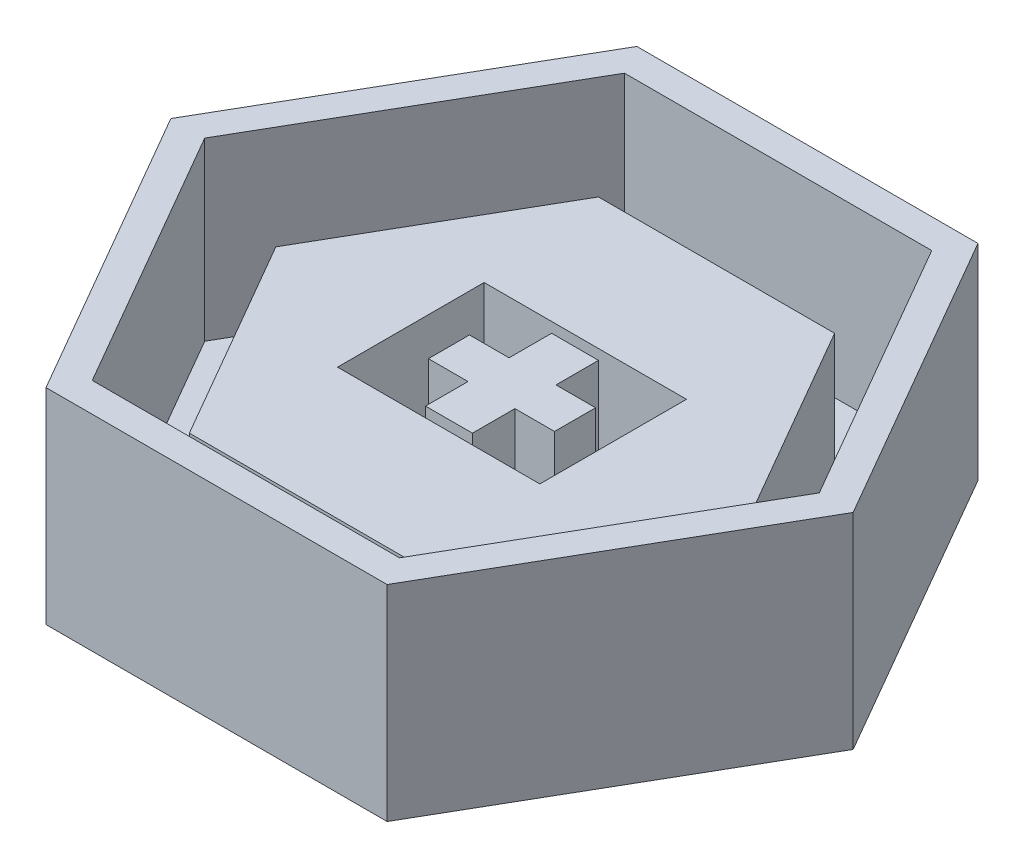
ISO-10303-21;
HEADER;
FILE_DESCRIPTION(('STEP AP214'),'2;1');
FILE_NAME('part.step','',(''),(''),'','','');
FILE_SCHEMA(('AUTOMOTIVE_DESIGN { 1 0 10303 214 1 1 1 1 }'));
ENDSEC;
DATA;
#1=APPLICATION_CONTEXT('core data for automotive mechanical design processes');
#2=APPLICATION_PROTOCOL_DEFINITION('international standard','automotive_design',2000,#1);
#3=PRODUCT_CONTEXT('',#1,'mechanical');
#4=PRODUCT('Part','Part','',(#3));
#5=PRODUCT_RELATED_PRODUCT_CATEGORY('part','',(#4));
#6=PRODUCT_DEFINITION_FORMATION('','',#4);
#7=PRODUCT_DEFINITION_CONTEXT('part definition',#1,'design');
#8=PRODUCT_DEFINITION('design','',#6,#7);
#9=PRODUCT_DEFINITION_SHAPE('','',#8);
#10=(LENGTH_UNIT() NAMED_UNIT(*) SI_UNIT(.MILLI.,.METRE.));
#11=(NAMED_UNIT(*) PLANE_ANGLE_UNIT() SI_UNIT($,.RADIAN.));
#12=(NAMED_UNIT(*) SI_UNIT($,.STERADIAN.) SOLID_ANGLE_UNIT());
#13=UNCERTAINTY_MEASURE_WITH_UNIT(LENGTH_MEASURE(1.E-05),#10,'distance_accuracy_value','');
#14=(GEOMETRIC_REPRESENTATION_CONTEXT(3) GLOBAL_UNCERTAINTY_ASSIGNED_CONTEXT((#13)) GLOBAL_UNIT_ASSIGNED_CONTEXT((#10,
#11,#12)) REPRESENTATION_CONTEXT('',''));
#15=CARTESIAN_POINT('',(0.,0.,0.));
#16=DIRECTION('',(0.,0.,1.));
#17=DIRECTION('',(1.,0.,0.));
#18=AXIS2_PLACEMENT_3D('',#15,#16,#17);
#19=CARTESIAN_POINT('',(0.,0.,0.));
#20=DIRECTION('',(0.,-1.,0.));
#21=DIRECTION('',(0.,0.,-1.));
#22=AXIS2_PLACEMENT_3D('',#19,#20,#21);
#23=PLANE('',#22);
#24=DIRECTION('',(0.5,0.,0.866025403784439));
#25=VECTOR('',#24,1.);
#26=CARTESIAN_POINT('',(5.23945369289585,0.,-9.075));
#27=LINE('',#26,#25);
#28=CARTESIAN_POINT('',(5.23945369289585,0.,-9.075));
#29=VERTEX_POINT('',#28);
#30=CARTESIAN_POINT('',(10.4789073857917,0.,0.));
#31=VERTEX_POINT('',#30);
#32=EDGE_CURVE('E377',#29,#31,#27,.T.);
#33=ORIENTED_EDGE('',*,*,#32,.F.);
#34=DIRECTION('',(1.,0.,0.));
#35=VECTOR('',#34,1.);
#36=CARTESIAN_POINT('',(-5.23945369289585,0.,-9.075));
#37=LINE('',#36,#35);
#38=CARTESIAN_POINT('',(-5.23945369289585,0.,-9.075));
#39=VERTEX_POINT('',#38);
#40=EDGE_CURVE('E392',#39,#29,#37,.T.);
#41=ORIENTED_EDGE('',*,*,#40,.F.);
#42=DIRECTION('',(0.5,0.,-0.866025403784439));
#43=VECTOR('',#42,1.);
#44=CARTESIAN_POINT('',(-10.4789073857917,0.,0.));
#45=LINE('',#44,#43);
#46=CARTESIAN_POINT('',(-10.4789073857917,0.,0.));
#47=VERTEX_POINT('',#46);
#48=EDGE_CURVE('E389',#47,#39,#45,.T.);
#49=ORIENTED_EDGE('',*,*,#48,.F.);
#50=DIRECTION('',(-0.5,0.,-0.866025403784439));
#51=VECTOR('',#50,1.);
#52=CARTESIAN_POINT('',(-5.23945369289586,0.,9.075));
#53=LINE('',#52,#51);
#54=CARTESIAN_POINT('',(-5.23945369289586,0.,9.075));
#55=VERTEX_POINT('',#54);
#56=EDGE_CURVE('E386',#55,#47,#53,.T.);
#57=ORIENTED_EDGE('',*,*,#56,.F.);
#58=DIRECTION('',(-1.,0.,0.));
#59=VECTOR('',#58,1.);
#60=CARTESIAN_POINT('',(5.23945369289585,0.,9.075));
#61=LINE('',#60,#59);
#62=CARTESIAN_POINT('',(5.23945369289585,0.,9.075));
#63=VERTEX_POINT('',#62);
#64=EDGE_CURVE('E383',#63,#55,#61,.T.);
#65=ORIENTED_EDGE('',*,*,#64,.F.);
#66=DIRECTION('',(-0.5,0.,0.866025403784438));
#67=VECTOR('',#66,1.);
#68=CARTESIAN_POINT('',(10.4789073857917,0.,0.));
#69=LINE('',#68,#67);
#70=EDGE_CURVE('E380',#31,#63,#69,.T.);
#71=ORIENTED_EDGE('',*,*,#70,.F.);
#72=EDGE_LOOP('',(#33,#41,#49,#57,#65,#71));
#73=FACE_BOUND('',#72,.T.);
#74=DIRECTION('',(0.499999999999999,0.,-0.866025403784439));
#75=VECTOR('',#74,1.);
#76=CARTESIAN_POINT('',(4.02701812759764,0.,6.975));
#77=LINE('',#76,#75);
#78=CARTESIAN_POINT('',(4.02701812759764,0.,6.975));
#79=VERTEX_POINT('',#78);
#80=CARTESIAN_POINT('',(8.05403625519528,0.,0.));
#81=VERTEX_POINT('',#80);
#82=EDGE_CURVE('E265',#79,#81,#77,.T.);
#83=ORIENTED_EDGE('',*,*,#82,.F.);
#84=DIRECTION('',(1.,0.,0.));
#85=VECTOR('',#84,1.);
#86=CARTESIAN_POINT('',(-4.02701812759764,0.,6.975));
#87=LINE('',#86,#85);
#88=CARTESIAN_POINT('',(-4.02701812759764,0.,6.975));
#89=VERTEX_POINT('',#88);
#90=EDGE_CURVE('E588',#89,#79,#87,.T.);
#91=ORIENTED_EDGE('',*,*,#90,.F.);
#92=DIRECTION('',(0.5,0.,0.866025403784439));
#93=VECTOR('',#92,1.);
#94=CARTESIAN_POINT('',(-8.05403625519527,0.,0.));
#95=LINE('',#94,#93);
#96=CARTESIAN_POINT('',(-8.05403625519527,0.,0.));
#97=VERTEX_POINT('',#96);
#98=EDGE_CURVE('E290',#97,#89,#95,.T.);
#99=ORIENTED_EDGE('',*,*,#98,.F.);
#100=DIRECTION('',(-0.499999999999999,0.,0.866025403784439));
#101=VECTOR('',#100,1.);
#102=CARTESIAN_POINT('',(-4.02701812759764,0.,-6.975));
#103=LINE('',#102,#101);
#104=CARTESIAN_POINT('',(-4.02701812759764,0.,-6.975));
#105=VERTEX_POINT('',#104);
#106=EDGE_CURVE('E285',#105,#97,#103,.T.);
#107=ORIENTED_EDGE('',*,*,#106,.F.);
#108=DIRECTION('',(-1.,0.,0.));
#109=VECTOR('',#108,1.);
#110=CARTESIAN_POINT('',(4.02701812759764,0.,-6.975));
#111=LINE('',#110,#109);
#112=CARTESIAN_POINT('',(4.02701812759764,0.,-6.975));
#113=VERTEX_POINT('',#112);
#114=EDGE_CURVE('E55',#113,#105,#111,.T.);
#115=ORIENTED_EDGE('',*,*,#114,.F.);
#116=DIRECTION('',(-0.5,0.,-0.866025403784439));
#117=VECTOR('',#116,1.);
#118=CARTESIAN_POINT('',(8.05403625519528,0.,0.));
#119=LINE('',#118,#117);
#120=EDGE_CURVE('E50',#81,#113,#119,.T.);
#121=ORIENTED_EDGE('',*,*,#120,.F.);
#122=EDGE_LOOP('',(#83,#91,#99,#107,#115,#121));
#123=FACE_BOUND('',#122,.T.);
#124=ADVANCED_FACE('F35',(#73,#123),#23,.F.);
#125=CARTESIAN_POINT('',(-10.4789073857917,-31.7796334177867,0.));
#126=DIRECTION('',(0.866025403784438,0.,0.5));
#127=DIRECTION('',(0.5,0.,-0.866025403784439));
#128=AXIS2_PLACEMENT_3D('',#125,#126,#127);
#129=PLANE('',#128);
#130=ORIENTED_EDGE('',*,*,#48,.T.);
#131=DIRECTION('',(0.,1.,0.));
#132=VECTOR('',#131,1.);
#133=CARTESIAN_POINT('',(-5.23945369289585,-31.7796334177867,-9.075));
#134=LINE('',#133,#132);
#135=CARTESIAN_POINT('',(-5.23945369289585,6.,-9.075));
#136=VERTEX_POINT('',#135);
#137=EDGE_CURVE('E353',#39,#136,#134,.T.);
#138=ORIENTED_EDGE('',*,*,#137,.T.);
#139=DIRECTION('',(0.5,0.,-0.866025403784439));
#140=VECTOR('',#139,1.);
#141=CARTESIAN_POINT('',(-10.4789073857917,6.,0.));
#142=LINE('',#141,#140);
#143=CARTESIAN_POINT('',(-10.4789073857917,6.,0.));
#144=VERTEX_POINT('',#143);
#145=EDGE_CURVE('E314',#144,#136,#142,.T.);
#146=ORIENTED_EDGE('',*,*,#145,.F.);
#147=DIRECTION('',(0.,1.,0.));
#148=VECTOR('',#147,1.);
#149=CARTESIAN_POINT('',(-10.4789073857917,-31.7796334177867,0.));
#150=LINE('',#149,#148);
#151=EDGE_CURVE('E355',#47,#144,#150,.T.);
#152=ORIENTED_EDGE('',*,*,#151,.F.);
#153=EDGE_LOOP('',(#130,#138,#146,#152));
#154=FACE_BOUND('',#153,.T.);
#155=ADVANCED_FACE('F545',(#154),#129,.T.);
#156=CARTESIAN_POINT('',(-5.23945369289586,-31.7796334177867,9.075));
#157=DIRECTION('',(0.866025403784439,0.,-0.5));
#158=DIRECTION('',(-0.5,0.,-0.866025403784439));
#159=AXIS2_PLACEMENT_3D('',#156,#157,#158);
#160=PLANE('',#159);
#161=ORIENTED_EDGE('',*,*,#56,.T.);
#162=ORIENTED_EDGE('',*,*,#151,.T.);
#163=DIRECTION('',(-0.5,0.,-0.866025403784439));
#164=VECTOR('',#163,1.);
#165=CARTESIAN_POINT('',(-5.23945369289586,6.,9.075));
#166=LINE('',#165,#164);
#167=CARTESIAN_POINT('',(-5.23945369289586,6.,9.075));
#168=VERTEX_POINT('',#167);
#169=EDGE_CURVE('E311',#168,#144,#166,.T.);
#170=ORIENTED_EDGE('',*,*,#169,.F.);
#171=DIRECTION('',(0.,1.,0.));
#172=VECTOR('',#171,1.);
#173=CARTESIAN_POINT('',(-5.23945369289586,-31.7796334177867,9.075));
#174=LINE('',#173,#172);
#175=EDGE_CURVE('E357',#55,#168,#174,.T.);
#176=ORIENTED_EDGE('',*,*,#175,.F.);
#177=EDGE_LOOP('',(#161,#162,#170,#176));
#178=FACE_BOUND('',#177,.T.);
#179=ADVANCED_FACE('F551',(#178),#160,.T.);
#180=CARTESIAN_POINT('',(5.23945369289585,-31.7796334177867,9.075));
#181=DIRECTION('',(0.,0.,-1.));
#182=DIRECTION('',(-1.,0.,0.));
#183=AXIS2_PLACEMENT_3D('',#180,#181,#182);
#184=PLANE('',#183);
#185=ORIENTED_EDGE('',*,*,#64,.T.);
#186=ORIENTED_EDGE('',*,*,#175,.T.);
#187=DIRECTION('',(-1.,0.,0.));
#188=VECTOR('',#187,1.);
#189=CARTESIAN_POINT('',(5.23945369289585,6.,9.075));
#190=LINE('',#189,#188);
#191=CARTESIAN_POINT('',(5.23945369289585,6.,9.075));
#192=VERTEX_POINT('',#191);
#193=EDGE_CURVE('E308',#192,#168,#190,.T.);
#194=ORIENTED_EDGE('',*,*,#193,.F.);
#195=DIRECTION('',(0.,1.,0.));
#196=VECTOR('',#195,1.);
#197=CARTESIAN_POINT('',(5.23945369289585,-31.7796334177867,9.075));
#198=LINE('',#197,#196);
#199=EDGE_CURVE('E359',#63,#192,#198,.T.);
#200=ORIENTED_EDGE('',*,*,#199,.F.);
#201=EDGE_LOOP('',(#185,#186,#194,#200));
#202=FACE_BOUND('',#201,.T.);
#203=ADVANCED_FACE('F631',(#202),#184,.T.);
#204=CARTESIAN_POINT('',(10.4789073857917,-31.7796334177867,0.));
#205=DIRECTION('',(-0.866025403784438,0.,-0.5));
#206=DIRECTION('',(-0.5,0.,0.866025403784439));
#207=AXIS2_PLACEMENT_3D('',#204,#205,#206);
#208=PLANE('',#207);
#209=ORIENTED_EDGE('',*,*,#70,.T.);
#210=ORIENTED_EDGE('',*,*,#199,.T.);
#211=DIRECTION('',(-0.5,0.,0.866025403784438));
#212=VECTOR('',#211,1.);
#213=CARTESIAN_POINT('',(10.4789073857917,6.,0.));
#214=LINE('',#213,#212);
#215=CARTESIAN_POINT('',(10.4789073857917,6.,0.));
#216=VERTEX_POINT('',#215);
#217=EDGE_CURVE('E305',#216,#192,#214,.T.);
#218=ORIENTED_EDGE('',*,*,#217,.F.);
#219=DIRECTION('',(0.,1.,0.));
#220=VECTOR('',#219,1.);
#221=CARTESIAN_POINT('',(10.4789073857917,-31.7796334177867,0.));
#222=LINE('',#221,#220);
#223=EDGE_CURVE('E361',#31,#216,#222,.T.);
#224=ORIENTED_EDGE('',*,*,#223,.F.);
#225=EDGE_LOOP('',(#209,#210,#218,#224));
#226=FACE_BOUND('',#225,.T.);
#227=ADVANCED_FACE('F635',(#226),#208,.T.);
#228=CARTESIAN_POINT('',(5.23945369289585,-31.7796334177867,-9.075));
#229=DIRECTION('',(-0.866025403784439,0.,0.5));
#230=DIRECTION('',(0.5,0.,0.866025403784439));
#231=AXIS2_PLACEMENT_3D('',#228,#229,#230);
#232=PLANE('',#231);
#233=ORIENTED_EDGE('',*,*,#32,.T.);
#234=ORIENTED_EDGE('',*,*,#223,.T.);
#235=DIRECTION('',(0.5,0.,0.866025403784439));
#236=VECTOR('',#235,1.);
#237=CARTESIAN_POINT('',(5.23945369289585,6.,-9.075));
#238=LINE('',#237,#236);
#239=CARTESIAN_POINT('',(5.23945369289585,6.,-9.075));
#240=VERTEX_POINT('',#239);
#241=EDGE_CURVE('E302',#240,#216,#238,.T.);
#242=ORIENTED_EDGE('',*,*,#241,.F.);
#243=DIRECTION('',(0.,1.,0.));
#244=VECTOR('',#243,1.);
#245=CARTESIAN_POINT('',(5.23945369289585,-31.7796334177867,-9.075));
#246=LINE('',#245,#244);
#247=EDGE_CURVE('E363',#29,#240,#246,.T.);
#248=ORIENTED_EDGE('',*,*,#247,.F.);
#249=EDGE_LOOP('',(#233,#234,#242,#248));
#250=FACE_BOUND('',#249,.T.);
#251=ADVANCED_FACE('F639',(#250),#232,.T.);
#252=CARTESIAN_POINT('',(-5.23945369289585,-31.7796334177867,-9.075));
#253=DIRECTION('',(0.,0.,1.));
#254=DIRECTION('',(1.,0.,0.));
#255=AXIS2_PLACEMENT_3D('',#252,#253,#254);
#256=PLANE('',#255);
#257=ORIENTED_EDGE('',*,*,#40,.T.);
#258=ORIENTED_EDGE('',*,*,#247,.T.);
#259=DIRECTION('',(1.,0.,0.));
#260=VECTOR('',#259,1.);
#261=CARTESIAN_POINT('',(-5.23945369289585,6.,-9.075));
#262=LINE('',#261,#260);
#263=EDGE_CURVE('E297',#136,#240,#262,.T.);
#264=ORIENTED_EDGE('',*,*,#263,.F.);
#265=ORIENTED_EDGE('',*,*,#137,.F.);
#266=EDGE_LOOP('',(#257,#258,#264,#265));
#267=FACE_BOUND('',#266,.T.);
#268=ADVANCED_FACE('F643',(#267),#256,.T.);
#269=CARTESIAN_POINT('',(-11.633607924171,-31.7796334177867,0.));
#270=DIRECTION('',(0.866025403784439,0.,0.5));
#271=DIRECTION('',(0.5,0.,-0.866025403784439));
#272=AXIS2_PLACEMENT_3D('',#269,#270,#271);
#273=PLANE('',#272);
#274=DIRECTION('',(0.5,0.,-0.866025403784439));
#275=VECTOR('',#274,1.);
#276=CARTESIAN_POINT('',(-11.633607924171,-1.,0.));
#277=LINE('',#276,#275);
#278=CARTESIAN_POINT('',(-11.633607924171,-1.,0.));
#279=VERTEX_POINT('',#278);
#280=CARTESIAN_POINT('',(-5.81680396208548,-1.,-10.075));
#281=VERTEX_POINT('',#280);
#282=EDGE_CURVE('E335',#279,#281,#277,.T.);
#283=ORIENTED_EDGE('',*,*,#282,.F.);
#284=DIRECTION('',(0.,1.,0.));
#285=VECTOR('',#284,1.);
#286=CARTESIAN_POINT('',(-11.633607924171,-31.7796334177867,0.));
#287=LINE('',#286,#285);
#288=CARTESIAN_POINT('',(-11.633607924171,6.,0.));
#289=VERTEX_POINT('',#288);
#290=EDGE_CURVE('E367',#279,#289,#287,.T.);
#291=ORIENTED_EDGE('',*,*,#290,.T.);
#292=DIRECTION('',(0.5,0.,-0.866025403784439));
#293=VECTOR('',#292,1.);
#294=CARTESIAN_POINT('',(-11.633607924171,6.,0.));
#295=LINE('',#294,#293);
#296=CARTESIAN_POINT('',(-5.81680396208548,6.,-10.075));
#297=VERTEX_POINT('',#296);
#298=EDGE_CURVE('E332',#289,#297,#295,.T.);
#299=ORIENTED_EDGE('',*,*,#298,.T.);
#300=DIRECTION('',(0.,1.,0.));
#301=VECTOR('',#300,1.);
#302=CARTESIAN_POINT('',(-5.81680396208548,-31.7796334177867,-10.075));
#303=LINE('',#302,#301);
#304=EDGE_CURVE('E365',#281,#297,#303,.T.);
#305=ORIENTED_EDGE('',*,*,#304,.F.);
#306=EDGE_LOOP('',(#283,#291,#299,#305));
#307=FACE_BOUND('',#306,.T.);
#308=ADVANCED_FACE('F647',(#307),#273,.F.);
#309=CARTESIAN_POINT('',(-5.81680396208548,-31.7796334177867,10.075));
#310=DIRECTION('',(0.866025403784439,0.,-0.5));
#311=DIRECTION('',(-0.5,0.,-0.866025403784439));
#312=AXIS2_PLACEMENT_3D('',#309,#310,#311);
#313=PLANE('',#312);
#314=DIRECTION('',(-0.5,0.,-0.866025403784439));
#315=VECTOR('',#314,1.);
#316=CARTESIAN_POINT('',(-5.81680396208548,-1.,10.075));
#317=LINE('',#316,#315);
#318=CARTESIAN_POINT('',(-5.81680396208548,-1.,10.075));
#319=VERTEX_POINT('',#318);
#320=EDGE_CURVE('E338',#319,#279,#317,.T.);
#321=ORIENTED_EDGE('',*,*,#320,.F.);
#322=DIRECTION('',(0.,1.,0.));
#323=VECTOR('',#322,1.);
#324=CARTESIAN_POINT('',(-5.81680396208548,-31.7796334177867,10.075));
#325=LINE('',#324,#323);
#326=CARTESIAN_POINT('',(-5.81680396208548,6.,10.075));
#327=VERTEX_POINT('',#326);
#328=EDGE_CURVE('E369',#319,#327,#325,.T.);
#329=ORIENTED_EDGE('',*,*,#328,.T.);
#330=DIRECTION('',(-0.5,0.,-0.866025403784439));
#331=VECTOR('',#330,1.);
#332=CARTESIAN_POINT('',(-5.81680396208548,6.,10.075));
#333=LINE('',#332,#331);
#334=EDGE_CURVE('E329',#327,#289,#333,.T.);
#335=ORIENTED_EDGE('',*,*,#334,.T.);
#336=ORIENTED_EDGE('',*,*,#290,.F.);
#337=EDGE_LOOP('',(#321,#329,#335,#336));
#338=FACE_BOUND('',#337,.T.);
#339=ADVANCED_FACE('F651',(#338),#313,.F.);
#340=CARTESIAN_POINT('',(5.81680396208548,-31.7796334177867,10.075));
#341=DIRECTION('',(0.,0.,-1.));
#342=DIRECTION('',(-1.,0.,0.));
#343=AXIS2_PLACEMENT_3D('',#340,#341,#342);
#344=PLANE('',#343);
#345=DIRECTION('',(-1.,0.,0.));
#346=VECTOR('',#345,1.);
#347=CARTESIAN_POINT('',(5.81680396208548,-1.,10.075));
#348=LINE('',#347,#346);
#349=CARTESIAN_POINT('',(5.81680396208548,-1.,10.075));
#350=VERTEX_POINT('',#349);
#351=EDGE_CURVE('E341',#350,#319,#348,.T.);
#352=ORIENTED_EDGE('',*,*,#351,.F.);
#353=DIRECTION('',(0.,1.,0.));
#354=VECTOR('',#353,1.);
#355=CARTESIAN_POINT('',(5.81680396208548,-31.7796334177867,10.075));
#356=LINE('',#355,#354);
#357=CARTESIAN_POINT('',(5.81680396208548,6.,10.075));
#358=VERTEX_POINT('',#357);
#359=EDGE_CURVE('E371',#350,#358,#356,.T.);
#360=ORIENTED_EDGE('',*,*,#359,.T.);
#361=DIRECTION('',(-1.,0.,0.));
#362=VECTOR('',#361,1.);
#363=CARTESIAN_POINT('',(5.81680396208548,6.,10.075));
#364=LINE('',#363,#362);
#365=EDGE_CURVE('E326',#358,#327,#364,.T.);
#366=ORIENTED_EDGE('',*,*,#365,.T.);
#367=ORIENTED_EDGE('',*,*,#328,.F.);
#368=EDGE_LOOP('',(#352,#360,#366,#367));
#369=FACE_BOUND('',#368,.T.);
#370=ADVANCED_FACE('F655',(#369),#344,.F.);
#371=CARTESIAN_POINT('',(11.633607924171,-31.7796334177867,0.));
#372=DIRECTION('',(-0.866025403784439,0.,-0.5));
#373=DIRECTION('',(-0.5,0.,0.866025403784439));
#374=AXIS2_PLACEMENT_3D('',#371,#372,#373);
#375=PLANE('',#374);
#376=DIRECTION('',(-0.5,0.,0.866025403784439));
#377=VECTOR('',#376,1.);
#378=CARTESIAN_POINT('',(11.633607924171,-1.,0.));
#379=LINE('',#378,#377);
#380=CARTESIAN_POINT('',(11.633607924171,-1.,0.));
#381=VERTEX_POINT('',#380);
#382=EDGE_CURVE('E344',#381,#350,#379,.T.);
#383=ORIENTED_EDGE('',*,*,#382,.F.);
#384=DIRECTION('',(0.,1.,0.));
#385=VECTOR('',#384,1.);
#386=CARTESIAN_POINT('',(11.633607924171,-31.7796334177867,0.));
#387=LINE('',#386,#385);
#388=CARTESIAN_POINT('',(11.633607924171,6.,0.));
#389=VERTEX_POINT('',#388);
#390=EDGE_CURVE('E373',#381,#389,#387,.T.);
#391=ORIENTED_EDGE('',*,*,#390,.T.);
#392=DIRECTION('',(-0.5,0.,0.866025403784439));
#393=VECTOR('',#392,1.);
#394=CARTESIAN_POINT('',(11.633607924171,6.,0.));
#395=LINE('',#394,#393);
#396=EDGE_CURVE('E323',#389,#358,#395,.T.);
#397=ORIENTED_EDGE('',*,*,#396,.T.);
#398=ORIENTED_EDGE('',*,*,#359,.F.);
#399=EDGE_LOOP('',(#383,#391,#397,#398));
#400=FACE_BOUND('',#399,.T.);
#401=ADVANCED_FACE('F659',(#400),#375,.F.);
#402=CARTESIAN_POINT('',(5.81680396208548,-31.7796334177867,-10.075));
#403=DIRECTION('',(-0.866025403784439,0.,0.5));
#404=DIRECTION('',(0.5,0.,0.866025403784439));
#405=AXIS2_PLACEMENT_3D('',#402,#403,#404);
#406=PLANE('',#405);
#407=DIRECTION('',(0.5,0.,0.866025403784439));
#408=VECTOR('',#407,1.);
#409=CARTESIAN_POINT('',(5.81680396208548,-1.,-10.075));
#410=LINE('',#409,#408);
#411=CARTESIAN_POINT('',(5.81680396208548,-1.,-10.075));
#412=VERTEX_POINT('',#411);
#413=EDGE_CURVE('E347',#412,#381,#410,.T.);
#414=ORIENTED_EDGE('',*,*,#413,.F.);
#415=DIRECTION('',(0.,1.,0.));
#416=VECTOR('',#415,1.);
#417=CARTESIAN_POINT('',(5.81680396208548,-31.7796334177867,-10.075));
#418=LINE('',#417,#416);
#419=CARTESIAN_POINT('',(5.81680396208548,6.,-10.075));
#420=VERTEX_POINT('',#419);
#421=EDGE_CURVE('E375',#412,#420,#418,.T.);
#422=ORIENTED_EDGE('',*,*,#421,.T.);
#423=DIRECTION('',(0.5,0.,0.866025403784439));
#424=VECTOR('',#423,1.);
#425=CARTESIAN_POINT('',(5.81680396208548,6.,-10.075));
#426=LINE('',#425,#424);
#427=EDGE_CURVE('E320',#420,#389,#426,.T.);
#428=ORIENTED_EDGE('',*,*,#427,.T.);
#429=ORIENTED_EDGE('',*,*,#390,.F.);
#430=EDGE_LOOP('',(#414,#422,#428,#429));
#431=FACE_BOUND('',#430,.T.);
#432=ADVANCED_FACE('F663',(#431),#406,.F.);
#433=CARTESIAN_POINT('',(-5.81680396208548,-31.7796334177867,-10.075));
#434=DIRECTION('',(0.,0.,1.));
#435=DIRECTION('',(1.,0.,0.));
#436=AXIS2_PLACEMENT_3D('',#433,#434,#435);
#437=PLANE('',#436);
#438=DIRECTION('',(1.,0.,0.));
#439=VECTOR('',#438,1.);
#440=CARTESIAN_POINT('',(-5.81680396208548,-1.,-10.075));
#441=LINE('',#440,#439);
#442=EDGE_CURVE('E350',#281,#412,#441,.T.);
#443=ORIENTED_EDGE('',*,*,#442,.F.);
#444=ORIENTED_EDGE('',*,*,#304,.T.);
#445=DIRECTION('',(1.,0.,0.));
#446=VECTOR('',#445,1.);
#447=CARTESIAN_POINT('',(-5.81680396208548,6.,-10.075));
#448=LINE('',#447,#446);
#449=EDGE_CURVE('E317',#297,#420,#448,.T.);
#450=ORIENTED_EDGE('',*,*,#449,.T.);
#451=ORIENTED_EDGE('',*,*,#421,.F.);
#452=EDGE_LOOP('',(#443,#444,#450,#451));
#453=FACE_BOUND('',#452,.T.);
#454=ADVANCED_FACE('F626',(#453),#437,.F.);
#455=CARTESIAN_POINT('',(0.,6.,0.));
#456=DIRECTION('',(0.,-1.,0.));
#457=DIRECTION('',(0.,0.,-1.));
#458=AXIS2_PLACEMENT_3D('',#455,#456,#457);
#459=PLANE('',#458);
#460=ORIENTED_EDGE('',*,*,#145,.T.);
#461=ORIENTED_EDGE('',*,*,#263,.T.);
#462=ORIENTED_EDGE('',*,*,#241,.T.);
#463=ORIENTED_EDGE('',*,*,#217,.T.);
#464=ORIENTED_EDGE('',*,*,#193,.T.);
#465=ORIENTED_EDGE('',*,*,#169,.T.);
#466=EDGE_LOOP('',(#460,#461,#462,#463,#464,#465));
#467=FACE_BOUND('',#466,.T.);
#468=ORIENTED_EDGE('',*,*,#449,.F.);
#469=ORIENTED_EDGE('',*,*,#298,.F.);
#470=ORIENTED_EDGE('',*,*,#334,.F.);
#471=ORIENTED_EDGE('',*,*,#365,.F.);
#472=ORIENTED_EDGE('',*,*,#396,.F.);
#473=ORIENTED_EDGE('',*,*,#427,.F.);
#474=EDGE_LOOP('',(#468,#469,#470,#471,#472,#473));
#475=FACE_BOUND('',#474,.T.);
#476=ADVANCED_FACE('F623',(#467,#475),#459,.F.);
#477=CARTESIAN_POINT('',(0.,-1.,0.));
#478=DIRECTION('',(0.,-1.,0.));
#479=DIRECTION('',(0.,0.,-1.));
#480=AXIS2_PLACEMENT_3D('',#477,#478,#479);
#481=PLANE('',#480);
#482=ORIENTED_EDGE('',*,*,#282,.T.);
#483=ORIENTED_EDGE('',*,*,#442,.T.);
#484=ORIENTED_EDGE('',*,*,#413,.T.);
#485=ORIENTED_EDGE('',*,*,#382,.T.);
#486=ORIENTED_EDGE('',*,*,#351,.T.);
#487=ORIENTED_EDGE('',*,*,#320,.T.);
#488=EDGE_LOOP('',(#482,#483,#484,#485,#486,#487));
#489=FACE_BOUND('',#488,.T.);
#490=ADVANCED_FACE('F625',(#489),#481,.T.);
#491=CARTESIAN_POINT('',(4.02701812759764,27.3089769815446,6.975));
#492=DIRECTION('',(-0.866025403784439,0.,-0.499999999999999));
#493=DIRECTION('',(-0.499999999999999,0.,0.866025403784439));
#494=AXIS2_PLACEMENT_3D('',#491,#492,#493);
#495=PLANE('',#494);
#496=DIRECTION('',(0.,-1.,0.));
#497=VECTOR('',#496,1.);
#498=CARTESIAN_POINT('',(8.05403625519528,27.3089769815446,0.));
#499=LINE('',#498,#497);
#500=CARTESIAN_POINT('',(8.05403625519528,4.,0.));
#501=VERTEX_POINT('',#500);
#502=EDGE_CURVE('E264',#501,#81,#499,.T.);
#503=ORIENTED_EDGE('',*,*,#502,.F.);
#504=DIRECTION('',(-0.499999999999999,0.,0.866025403784439));
#505=VECTOR('',#504,1.);
#506=CARTESIAN_POINT('',(4.02701812759764,4.,6.975));
#507=LINE('',#506,#505);
#508=CARTESIAN_POINT('',(4.02701812759764,4.,6.975));
#509=VERTEX_POINT('',#508);
#510=EDGE_CURVE('E261',#501,#509,#507,.T.);
#511=ORIENTED_EDGE('',*,*,#510,.T.);
#512=DIRECTION('',(0.,-1.,0.));
#513=VECTOR('',#512,1.);
#514=CARTESIAN_POINT('',(4.02701812759764,27.3089769815446,6.975));
#515=LINE('',#514,#513);
#516=EDGE_CURVE('E574',#509,#79,#515,.T.);
#517=ORIENTED_EDGE('',*,*,#516,.T.);
#518=ORIENTED_EDGE('',*,*,#82,.T.);
#519=EDGE_LOOP('',(#503,#511,#517,#518));
#520=FACE_BOUND('',#519,.T.);
#521=ADVANCED_FACE('F671',(#520),#495,.F.);
#522=CARTESIAN_POINT('',(8.05403625519528,27.3089769815446,0.));
#523=DIRECTION('',(-0.866025403784439,0.,0.5));
#524=DIRECTION('',(0.5,0.,0.866025403784439));
#525=AXIS2_PLACEMENT_3D('',#522,#523,#524);
#526=PLANE('',#525);
#527=DIRECTION('',(0.,-1.,0.));
#528=VECTOR('',#527,1.);
#529=CARTESIAN_POINT('',(4.02701812759764,27.3089769815446,-6.975));
#530=LINE('',#529,#528);
#531=CARTESIAN_POINT('',(4.02701812759764,4.,-6.975));
#532=VERTEX_POINT('',#531);
#533=EDGE_CURVE('E267',#532,#113,#530,.T.);
#534=ORIENTED_EDGE('',*,*,#533,.F.);
#535=DIRECTION('',(0.5,0.,0.866025403784439));
#536=VECTOR('',#535,1.);
#537=CARTESIAN_POINT('',(8.05403625519528,4.,0.));
#538=LINE('',#537,#536);
#539=EDGE_CURVE('E254',#532,#501,#538,.T.);
#540=ORIENTED_EDGE('',*,*,#539,.T.);
#541=ORIENTED_EDGE('',*,*,#502,.T.);
#542=ORIENTED_EDGE('',*,*,#120,.T.);
#543=EDGE_LOOP('',(#534,#540,#541,#542));
#544=FACE_BOUND('',#543,.T.);
#545=ADVANCED_FACE('F268',(#544),#526,.F.);
#546=CARTESIAN_POINT('',(4.02701812759764,27.3089769815446,-6.975));
#547=DIRECTION('',(0.,0.,1.));
#548=DIRECTION('',(1.,0.,0.));
#549=AXIS2_PLACEMENT_3D('',#546,#547,#548);
#550=PLANE('',#549);
#551=DIRECTION('',(0.,-1.,0.));
#552=VECTOR('',#551,1.);
#553=CARTESIAN_POINT('',(-4.02701812759764,27.3089769815446,-6.975));
#554=LINE('',#553,#552);
#555=CARTESIAN_POINT('',(-4.02701812759764,4.,-6.975));
#556=VERTEX_POINT('',#555);
#557=EDGE_CURVE('E273',#556,#105,#554,.T.);
#558=ORIENTED_EDGE('',*,*,#557,.F.);
#559=DIRECTION('',(1.,0.,0.));
#560=VECTOR('',#559,1.);
#561=CARTESIAN_POINT('',(4.02701812759764,4.,-6.975));
#562=LINE('',#561,#560);
#563=EDGE_CURVE('E258',#556,#532,#562,.T.);
#564=ORIENTED_EDGE('',*,*,#563,.T.);
#565=ORIENTED_EDGE('',*,*,#533,.T.);
#566=ORIENTED_EDGE('',*,*,#114,.T.);
#567=EDGE_LOOP('',(#558,#564,#565,#566));
#568=FACE_BOUND('',#567,.T.);
#569=ADVANCED_FACE('F271',(#568),#550,.F.);
#570=CARTESIAN_POINT('',(-4.02701812759764,27.3089769815446,-6.975));
#571=DIRECTION('',(0.866025403784439,0.,0.499999999999999));
#572=DIRECTION('',(0.499999999999999,0.,-0.866025403784439));
#573=AXIS2_PLACEMENT_3D('',#570,#571,#572);
#574=PLANE('',#573);
#575=DIRECTION('',(0.,-1.,0.));
#576=VECTOR('',#575,1.);
#577=CARTESIAN_POINT('',(-8.05403625519527,27.3089769815446,0.));
#578=LINE('',#577,#576);
#579=CARTESIAN_POINT('',(-8.05403625519527,4.,0.));
#580=VERTEX_POINT('',#579);
#581=EDGE_CURVE('E284',#580,#97,#578,.T.);
#582=ORIENTED_EDGE('',*,*,#581,.F.);
#583=DIRECTION('',(0.499999999999999,0.,-0.866025403784439));
#584=VECTOR('',#583,1.);
#585=CARTESIAN_POINT('',(-4.02701812759764,4.,-6.975));
#586=LINE('',#585,#584);
#587=EDGE_CURVE('E279',#580,#556,#586,.T.);
#588=ORIENTED_EDGE('',*,*,#587,.T.);
#589=ORIENTED_EDGE('',*,*,#557,.T.);
#590=ORIENTED_EDGE('',*,*,#106,.T.);
#591=EDGE_LOOP('',(#582,#588,#589,#590));
#592=FACE_BOUND('',#591,.T.);
#593=ADVANCED_FACE('F712',(#592),#574,.F.);
#594=CARTESIAN_POINT('',(-8.05403625519527,27.3089769815446,0.));
#595=DIRECTION('',(0.866025403784439,0.,-0.5));
#596=DIRECTION('',(-0.5,0.,-0.866025403784439));
#597=AXIS2_PLACEMENT_3D('',#594,#595,#596);
#598=PLANE('',#597);
#599=DIRECTION('',(0.,-1.,0.));
#600=VECTOR('',#599,1.);
#601=CARTESIAN_POINT('',(-4.02701812759764,27.3089769815446,6.975));
#602=LINE('',#601,#600);
#603=CARTESIAN_POINT('',(-4.02701812759764,4.,6.975));
#604=VERTEX_POINT('',#603);
#605=EDGE_CURVE('E289',#604,#89,#602,.T.);
#606=ORIENTED_EDGE('',*,*,#605,.F.);
#607=DIRECTION('',(-0.5,0.,-0.866025403784439));
#608=VECTOR('',#607,1.);
#609=CARTESIAN_POINT('',(-8.05403625519527,4.,0.));
#610=LINE('',#609,#608);
#611=EDGE_CURVE('E281',#604,#580,#610,.T.);
#612=ORIENTED_EDGE('',*,*,#611,.T.);
#613=ORIENTED_EDGE('',*,*,#581,.T.);
#614=ORIENTED_EDGE('',*,*,#98,.T.);
#615=EDGE_LOOP('',(#606,#612,#613,#614));
#616=FACE_BOUND('',#615,.T.);
#617=ADVANCED_FACE('F706',(#616),#598,.F.);
#618=CARTESIAN_POINT('',(-4.02701812759764,27.3089769815446,6.975));
#619=DIRECTION('',(0.,0.,-1.));
#620=DIRECTION('',(-1.,0.,0.));
#621=AXIS2_PLACEMENT_3D('',#618,#619,#620);
#622=PLANE('',#621);
#623=ORIENTED_EDGE('',*,*,#516,.F.);
#624=DIRECTION('',(-1.,0.,0.));
#625=VECTOR('',#624,1.);
#626=CARTESIAN_POINT('',(-4.02701812759764,4.,6.975));
#627=LINE('',#626,#625);
#628=EDGE_CURVE('E286',#509,#604,#627,.T.);
#629=ORIENTED_EDGE('',*,*,#628,.T.);
#630=ORIENTED_EDGE('',*,*,#605,.T.);
#631=ORIENTED_EDGE('',*,*,#90,.T.);
#632=EDGE_LOOP('',(#623,#629,#630,#631));
#633=FACE_BOUND('',#632,.T.);
#634=ADVANCED_FACE('F702',(#633),#622,.F.);
#635=CARTESIAN_POINT('',(-3.45,27.3089769815446,-2.5));
#636=DIRECTION('',(1.,0.,0.));
#637=DIRECTION('',(0.,0.,-1.));
#638=AXIS2_PLACEMENT_3D('',#635,#636,#637);
#639=PLANE('',#638);
#640=DIRECTION('',(0.,0.,-1.));
#641=VECTOR('',#640,1.);
#642=CARTESIAN_POINT('',(-3.45,4.,-2.5));
#643=LINE('',#642,#641);
#644=CARTESIAN_POINT('',(-3.45,4.,2.5));
#645=VERTEX_POINT('',#644);
#646=CARTESIAN_POINT('',(-3.45,4.,-2.5));
#647=VERTEX_POINT('',#646);
#648=EDGE_CURVE('E291',#645,#647,#643,.T.);
#649=ORIENTED_EDGE('',*,*,#648,.F.);
#650=DIRECTION('',(0.,-1.,0.));
#651=VECTOR('',#650,1.);
#652=CARTESIAN_POINT('',(-3.45,27.3089769815446,2.5));
#653=LINE('',#652,#651);
#654=CARTESIAN_POINT('',(-3.45,0.,2.5));
#655=VERTEX_POINT('',#654);
#656=EDGE_CURVE('E591',#645,#655,#653,.T.);
#657=ORIENTED_EDGE('',*,*,#656,.T.);
#658=DIRECTION('',(0.,0.,1.));
#659=VECTOR('',#658,1.);
#660=CARTESIAN_POINT('',(-3.45,0.,-2.5));
#661=LINE('',#660,#659);
#662=CARTESIAN_POINT('',(-3.45,0.,-2.5));
#663=VERTEX_POINT('',#662);
#664=EDGE_CURVE('E567',#663,#655,#661,.T.);
#665=ORIENTED_EDGE('',*,*,#664,.F.);
#666=DIRECTION('',(0.,-1.,0.));
#667=VECTOR('',#666,1.);
#668=CARTESIAN_POINT('',(-3.45,27.3089769815446,-2.5));
#669=LINE('',#668,#667);
#670=EDGE_CURVE('E294',#647,#663,#669,.T.);
#671=ORIENTED_EDGE('',*,*,#670,.F.);
#672=EDGE_LOOP('',(#649,#657,#665,#671));
#673=FACE_BOUND('',#672,.T.);
#674=ADVANCED_FACE('F602',(#673),#639,.T.);
#675=CARTESIAN_POINT('',(3.45,27.3089769815446,2.5));
#676=DIRECTION('',(0.,0.,-1.));
#677=DIRECTION('',(-1.,0.,0.));
#678=AXIS2_PLACEMENT_3D('',#675,#676,#677);
#679=PLANE('',#678);
#680=DIRECTION('',(-1.,0.,0.));
#681=VECTOR('',#680,1.);
#682=CARTESIAN_POINT('',(3.45,4.,2.5));
#683=LINE('',#682,#681);
#684=CARTESIAN_POINT('',(3.45,4.,2.5));
#685=VERTEX_POINT('',#684);
#686=EDGE_CURVE('E295',#685,#645,#683,.T.);
#687=ORIENTED_EDGE('',*,*,#686,.F.);
#688=DIRECTION('',(0.,-1.,0.));
#689=VECTOR('',#688,1.);
#690=CARTESIAN_POINT('',(3.45,27.3089769815446,2.5));
#691=LINE('',#690,#689);
#692=CARTESIAN_POINT('',(3.45,0.,2.5));
#693=VERTEX_POINT('',#692);
#694=EDGE_CURVE('E593',#685,#693,#691,.T.);
#695=ORIENTED_EDGE('',*,*,#694,.T.);
#696=DIRECTION('',(1.,0.,0.));
#697=VECTOR('',#696,1.);
#698=CARTESIAN_POINT('',(3.45,0.,2.5));
#699=LINE('',#698,#697);
#700=EDGE_CURVE('E575',#655,#693,#699,.T.);
#701=ORIENTED_EDGE('',*,*,#700,.F.);
#702=ORIENTED_EDGE('',*,*,#656,.F.);
#703=EDGE_LOOP('',(#687,#695,#701,#702));
#704=FACE_BOUND('',#703,.T.);
#705=ADVANCED_FACE('F607',(#704),#679,.T.);
#706=CARTESIAN_POINT('',(3.45,27.3089769815446,-2.5));
#707=DIRECTION('',(-1.,0.,0.));
#708=DIRECTION('',(0.,0.,1.));
#709=AXIS2_PLACEMENT_3D('',#706,#707,#708);
#710=PLANE('',#709);
#711=DIRECTION('',(0.,0.,1.));
#712=VECTOR('',#711,1.);
#713=CARTESIAN_POINT('',(3.45,4.,-2.5));
#714=LINE('',#713,#712);
#715=CARTESIAN_POINT('',(3.45,4.,-2.5));
#716=VERTEX_POINT('',#715);
#717=EDGE_CURVE('E298',#716,#685,#714,.T.);
#718=ORIENTED_EDGE('',*,*,#717,.F.);
#719=DIRECTION('',(0.,-1.,0.));
#720=VECTOR('',#719,1.);
#721=CARTESIAN_POINT('',(3.45,27.3089769815446,-2.5));
#722=LINE('',#721,#720);
#723=CARTESIAN_POINT('',(3.45,0.,-2.5));
#724=VERTEX_POINT('',#723);
#725=EDGE_CURVE('E595',#716,#724,#722,.T.);
#726=ORIENTED_EDGE('',*,*,#725,.T.);
#727=DIRECTION('',(0.,0.,-1.));
#728=VECTOR('',#727,1.);
#729=CARTESIAN_POINT('',(3.45,0.,-2.5));
#730=LINE('',#729,#728);
#731=EDGE_CURVE('E569',#693,#724,#730,.T.);
#732=ORIENTED_EDGE('',*,*,#731,.F.);
#733=ORIENTED_EDGE('',*,*,#694,.F.);
#734=EDGE_LOOP('',(#718,#726,#732,#733));
#735=FACE_BOUND('',#734,.T.);
#736=ADVANCED_FACE('F611',(#735),#710,.T.);
#737=CARTESIAN_POINT('',(3.45,27.3089769815446,-2.5));
#738=DIRECTION('',(0.,0.,1.));
#739=DIRECTION('',(1.,0.,0.));
#740=AXIS2_PLACEMENT_3D('',#737,#738,#739);
#741=PLANE('',#740);
#742=DIRECTION('',(1.,0.,0.));
#743=VECTOR('',#742,1.);
#744=CARTESIAN_POINT('',(3.45,4.,-2.5));
#745=LINE('',#744,#743);
#746=EDGE_CURVE('E293',#647,#716,#745,.T.);
#747=ORIENTED_EDGE('',*,*,#746,.F.);
#748=ORIENTED_EDGE('',*,*,#670,.T.);
#749=DIRECTION('',(-1.,0.,0.));
#750=VECTOR('',#749,1.);
#751=CARTESIAN_POINT('',(3.45,0.,-2.5));
#752=LINE('',#751,#750);
#753=EDGE_CURVE('E565',#724,#663,#752,.T.);
#754=ORIENTED_EDGE('',*,*,#753,.F.);
#755=ORIENTED_EDGE('',*,*,#725,.F.);
#756=EDGE_LOOP('',(#747,#748,#754,#755));
#757=FACE_BOUND('',#756,.T.);
#758=ADVANCED_FACE('F599',(#757),#741,.T.);
#759=CARTESIAN_POINT('',(0.,4.,0.));
#760=DIRECTION('',(0.,-1.,0.));
#761=DIRECTION('',(0.,0.,-1.));
#762=AXIS2_PLACEMENT_3D('',#759,#760,#761);
#763=PLANE('',#762);
#764=ORIENTED_EDGE('',*,*,#648,.T.);
#765=ORIENTED_EDGE('',*,*,#746,.T.);
#766=ORIENTED_EDGE('',*,*,#717,.T.);
#767=ORIENTED_EDGE('',*,*,#686,.T.);
#768=EDGE_LOOP('',(#764,#765,#766,#767));
#769=FACE_BOUND('',#768,.T.);
#770=ORIENTED_EDGE('',*,*,#539,.F.);
#771=ORIENTED_EDGE('',*,*,#563,.F.);
#772=ORIENTED_EDGE('',*,*,#587,.F.);
#773=ORIENTED_EDGE('',*,*,#611,.F.);
#774=ORIENTED_EDGE('',*,*,#628,.F.);
#775=ORIENTED_EDGE('',*,*,#510,.F.);
#776=EDGE_LOOP('',(#770,#771,#772,#773,#774,#775));
#777=FACE_BOUND('',#776,.T.);
#778=ADVANCED_FACE('F256',(#769,#777),#763,.F.);
#779=CARTESIAN_POINT('',(0.,4.,0.));
#780=DIRECTION('',(0.,-1.,0.));
#781=DIRECTION('',(0.,0.,-1.));
#782=AXIS2_PLACEMENT_3D('',#779,#780,#781);
#783=PLANE('',#782);
#784=DIRECTION('',(0.,0.,1.));
#785=VECTOR('',#784,1.);
#786=CARTESIAN_POINT('',(-0.8,4.,-0.7));
#787=LINE('',#786,#785);
#788=CARTESIAN_POINT('',(-0.8,4.,-2.15));
#789=VERTEX_POINT('',#788);
#790=CARTESIAN_POINT('',(-0.8,4.,-0.7));
#791=VERTEX_POINT('',#790);
#792=EDGE_CURVE('E396',#789,#791,#787,.T.);
#793=ORIENTED_EDGE('',*,*,#792,.T.);
#794=DIRECTION('',(-1.,0.,0.));
#795=VECTOR('',#794,1.);
#796=CARTESIAN_POINT('',(-2.15,4.,-0.7));
#797=LINE('',#796,#795);
#798=CARTESIAN_POINT('',(-2.15,4.,-0.7));
#799=VERTEX_POINT('',#798);
#800=EDGE_CURVE('E399',#791,#799,#797,.T.);
#801=ORIENTED_EDGE('',*,*,#800,.T.);
#802=DIRECTION('',(0.,0.,1.));
#803=VECTOR('',#802,1.);
#804=CARTESIAN_POINT('',(-2.15,4.,0.7));
#805=LINE('',#804,#803);
#806=CARTESIAN_POINT('',(-2.15,4.,0.7));
#807=VERTEX_POINT('',#806);
#808=EDGE_CURVE('E402',#799,#807,#805,.T.);
#809=ORIENTED_EDGE('',*,*,#808,.T.);
#810=DIRECTION('',(1.,0.,0.));
#811=VECTOR('',#810,1.);
#812=CARTESIAN_POINT('',(-0.799999999999999,4.,0.7));
#813=LINE('',#812,#811);
#814=CARTESIAN_POINT('',(-0.799999999999999,4.,0.7));
#815=VERTEX_POINT('',#814);
#816=EDGE_CURVE('E404',#807,#815,#813,.T.);
#817=ORIENTED_EDGE('',*,*,#816,.T.);
#818=DIRECTION('',(0.,0.,1.));
#819=VECTOR('',#818,1.);
#820=CARTESIAN_POINT('',(-0.799999999999999,4.,2.15));
#821=LINE('',#820,#819);
#822=CARTESIAN_POINT('',(-0.799999999999999,4.,2.15));
#823=VERTEX_POINT('',#822);
#824=EDGE_CURVE('E406',#815,#823,#821,.T.);
#825=ORIENTED_EDGE('',*,*,#824,.T.);
#826=DIRECTION('',(1.,0.,0.));
#827=VECTOR('',#826,1.);
#828=CARTESIAN_POINT('',(0.800000000000001,4.,2.15));
#829=LINE('',#828,#827);
#830=CARTESIAN_POINT('',(0.800000000000001,4.,2.15));
#831=VERTEX_POINT('',#830);
#832=EDGE_CURVE('E408',#823,#831,#829,.T.);
#833=ORIENTED_EDGE('',*,*,#832,.T.);
#834=DIRECTION('',(0.,0.,-1.));
#835=VECTOR('',#834,1.);
#836=CARTESIAN_POINT('',(0.8,4.,0.7));
#837=LINE('',#836,#835);
#838=CARTESIAN_POINT('',(0.8,4.,0.7));
#839=VERTEX_POINT('',#838);
#840=EDGE_CURVE('E410',#831,#839,#837,.T.);
#841=ORIENTED_EDGE('',*,*,#840,.T.);
#842=DIRECTION('',(1.,0.,0.));
#843=VECTOR('',#842,1.);
#844=CARTESIAN_POINT('',(2.15,4.,0.7));
#845=LINE('',#844,#843);
#846=CARTESIAN_POINT('',(2.15,4.,0.7));
#847=VERTEX_POINT('',#846);
#848=EDGE_CURVE('E412',#839,#847,#845,.T.);
#849=ORIENTED_EDGE('',*,*,#848,.T.);
#850=DIRECTION('',(0.,0.,-1.));
#851=VECTOR('',#850,1.);
#852=CARTESIAN_POINT('',(2.15,4.,-0.7));
#853=LINE('',#852,#851);
#854=CARTESIAN_POINT('',(2.15,4.,-0.7));
#855=VERTEX_POINT('',#854);
#856=EDGE_CURVE('E414',#847,#855,#853,.T.);
#857=ORIENTED_EDGE('',*,*,#856,.T.);
#858=DIRECTION('',(-1.,0.,0.));
#859=VECTOR('',#858,1.);
#860=CARTESIAN_POINT('',(0.8,4.,-0.7));
#861=LINE('',#860,#859);
#862=CARTESIAN_POINT('',(0.8,4.,-0.7));
#863=VERTEX_POINT('',#862);
#864=EDGE_CURVE('E416',#855,#863,#861,.T.);
#865=ORIENTED_EDGE('',*,*,#864,.T.);
#866=DIRECTION('',(0.,0.,-1.));
#867=VECTOR('',#866,1.);
#868=CARTESIAN_POINT('',(0.8,4.,-2.15));
#869=LINE('',#868,#867);
#870=CARTESIAN_POINT('',(0.8,4.,-2.15));
#871=VERTEX_POINT('',#870);
#872=EDGE_CURVE('E418',#863,#871,#869,.T.);
#873=ORIENTED_EDGE('',*,*,#872,.T.);
#874=DIRECTION('',(-1.,0.,0.));
#875=VECTOR('',#874,1.);
#876=CARTESIAN_POINT('',(-0.8,4.,-2.15));
#877=LINE('',#876,#875);
#878=EDGE_CURVE('E420',#871,#789,#877,.T.);
#879=ORIENTED_EDGE('',*,*,#878,.T.);
#880=EDGE_LOOP('',(#793,#801,#809,#817,#825,#833,#841,#849,#857,#865,#873,#879));
#881=FACE_BOUND('',#880,.T.);
#882=ADVANCED_FACE('F506',(#881),#783,.F.);
#883=CARTESIAN_POINT('',(-2.15,4.,-0.7));
#884=DIRECTION('',(0.,0.,1.));
#885=DIRECTION('',(1.,0.,0.));
#886=AXIS2_PLACEMENT_3D('',#883,#884,#885);
#887=PLANE('',#886);
#888=DIRECTION('',(-1.,0.,0.));
#889=VECTOR('',#888,1.);
#890=CARTESIAN_POINT('',(-2.15,0.,-0.7));
#891=LINE('',#890,#889);
#892=CARTESIAN_POINT('',(-0.8,0.,-0.7));
#893=VERTEX_POINT('',#892);
#894=CARTESIAN_POINT('',(-2.15,0.,-0.7));
#895=VERTEX_POINT('',#894);
#896=EDGE_CURVE('E425',#893,#895,#891,.T.);
#897=ORIENTED_EDGE('',*,*,#896,.T.);
#898=DIRECTION('',(0.,-1.,0.));
#899=VECTOR('',#898,1.);
#900=CARTESIAN_POINT('',(-2.15,4.,-0.7));
#901=LINE('',#900,#899);
#902=EDGE_CURVE('E43',#799,#895,#901,.T.);
#903=ORIENTED_EDGE('',*,*,#902,.F.);
#904=ORIENTED_EDGE('',*,*,#800,.F.);
#905=DIRECTION('',(0.,-1.,0.));
#906=VECTOR('',#905,1.);
#907=CARTESIAN_POINT('',(-0.8,4.,-0.7));
#908=LINE('',#907,#906);
#909=EDGE_CURVE('E12',#791,#893,#908,.T.);
#910=ORIENTED_EDGE('',*,*,#909,.T.);
#911=EDGE_LOOP('',(#897,#903,#904,#910));
#912=FACE_BOUND('',#911,.T.);
#913=ADVANCED_FACE('F492',(#912),#887,.F.);
#914=CARTESIAN_POINT('',(-2.15,4.,0.7));
#915=DIRECTION('',(1.,0.,0.));
#916=DIRECTION('',(0.,0.,-1.));
#917=AXIS2_PLACEMENT_3D('',#914,#915,#916);
#918=PLANE('',#917);
#919=DIRECTION('',(0.,0.,1.));
#920=VECTOR('',#919,1.);
#921=CARTESIAN_POINT('',(-2.15,0.,0.7));
#922=LINE('',#921,#920);
#923=CARTESIAN_POINT('',(-2.15,0.,0.7));
#924=VERTEX_POINT('',#923);
#925=EDGE_CURVE('E428',#895,#924,#922,.T.);
#926=ORIENTED_EDGE('',*,*,#925,.T.);
#927=DIRECTION('',(0.,-1.,0.));
#928=VECTOR('',#927,1.);
#929=CARTESIAN_POINT('',(-2.15,4.,0.7));
#930=LINE('',#929,#928);
#931=EDGE_CURVE('E483',#807,#924,#930,.T.);
#932=ORIENTED_EDGE('',*,*,#931,.F.);
#933=ORIENTED_EDGE('',*,*,#808,.F.);
#934=ORIENTED_EDGE('',*,*,#902,.T.);
#935=EDGE_LOOP('',(#926,#932,#933,#934));
#936=FACE_BOUND('',#935,.T.);
#937=ADVANCED_FACE('F489',(#936),#918,.F.);
#938=CARTESIAN_POINT('',(-0.799999999999999,4.,0.7));
#939=DIRECTION('',(0.,0.,-1.));
#940=DIRECTION('',(-1.,0.,0.));
#941=AXIS2_PLACEMENT_3D('',#938,#939,#940);
#942=PLANE('',#941);
#943=DIRECTION('',(1.,0.,0.));
#944=VECTOR('',#943,1.);
#945=CARTESIAN_POINT('',(-0.799999999999999,0.,0.7));
#946=LINE('',#945,#944);
#947=CARTESIAN_POINT('',(-0.799999999999999,0.,0.7));
#948=VERTEX_POINT('',#947);
#949=EDGE_CURVE('E431',#924,#948,#946,.T.);
#950=ORIENTED_EDGE('',*,*,#949,.T.);
#951=DIRECTION('',(0.,-1.,0.));
#952=VECTOR('',#951,1.);
#953=CARTESIAN_POINT('',(-0.799999999999999,4.,0.7));
#954=LINE('',#953,#952);
#955=EDGE_CURVE('E480',#815,#948,#954,.T.);
#956=ORIENTED_EDGE('',*,*,#955,.F.);
#957=ORIENTED_EDGE('',*,*,#816,.F.);
#958=ORIENTED_EDGE('',*,*,#931,.T.);
#959=EDGE_LOOP('',(#950,#956,#957,#958));
#960=FACE_BOUND('',#959,.T.);
#961=ADVANCED_FACE('F498',(#960),#942,.F.);
#962=CARTESIAN_POINT('',(-0.799999999999999,4.,2.15));
#963=DIRECTION('',(1.,0.,0.));
#964=DIRECTION('',(0.,0.,-1.));
#965=AXIS2_PLACEMENT_3D('',#962,#963,#964);
#966=PLANE('',#965);
#967=DIRECTION('',(0.,0.,1.));
#968=VECTOR('',#967,1.);
#969=CARTESIAN_POINT('',(-0.799999999999999,0.,2.15));
#970=LINE('',#969,#968);
#971=CARTESIAN_POINT('',(-0.799999999999999,0.,2.15));
#972=VERTEX_POINT('',#971);
#973=EDGE_CURVE('E434',#948,#972,#970,.T.);
#974=ORIENTED_EDGE('',*,*,#973,.T.);
#975=DIRECTION('',(0.,-1.,0.));
#976=VECTOR('',#975,1.);
#977=CARTESIAN_POINT('',(-0.799999999999999,4.,2.15));
#978=LINE('',#977,#976);
#979=EDGE_CURVE('E477',#823,#972,#978,.T.);
#980=ORIENTED_EDGE('',*,*,#979,.F.);
#981=ORIENTED_EDGE('',*,*,#824,.F.);
#982=ORIENTED_EDGE('',*,*,#955,.T.);
#983=EDGE_LOOP('',(#974,#980,#981,#982));
#984=FACE_BOUND('',#983,.T.);
#985=ADVANCED_FACE('F502',(#984),#966,.F.);
#986=CARTESIAN_POINT('',(0.800000000000001,4.,2.15));
#987=DIRECTION('',(0.,0.,-1.));
#988=DIRECTION('',(-1.,0.,0.));
#989=AXIS2_PLACEMENT_3D('',#986,#987,#988);
#990=PLANE('',#989);
#991=DIRECTION('',(1.,0.,0.));
#992=VECTOR('',#991,1.);
#993=CARTESIAN_POINT('',(0.800000000000001,0.,2.15));
#994=LINE('',#993,#992);
#995=CARTESIAN_POINT('',(0.800000000000001,0.,2.15));
#996=VERTEX_POINT('',#995);
#997=EDGE_CURVE('E437',#972,#996,#994,.T.);
#998=ORIENTED_EDGE('',*,*,#997,.T.);
#999=DIRECTION('',(0.,-1.,0.));
#1000=VECTOR('',#999,1.);
#1001=CARTESIAN_POINT('',(0.800000000000001,4.,2.15));
#1002=LINE('',#1001,#1000);
#1003=EDGE_CURVE('E474',#831,#996,#1002,.T.);
#1004=ORIENTED_EDGE('',*,*,#1003,.F.);
#1005=ORIENTED_EDGE('',*,*,#832,.F.);
#1006=ORIENTED_EDGE('',*,*,#979,.T.);
#1007=EDGE_LOOP('',(#998,#1004,#1005,#1006));
#1008=FACE_BOUND('',#1007,.T.);
#1009=ADVANCED_FACE('F535',(#1008),#990,.F.);
#1010=CARTESIAN_POINT('',(0.8,4.,0.7));
#1011=DIRECTION('',(-1.,0.,0.));
#1012=DIRECTION('',(0.,0.,1.));
#1013=AXIS2_PLACEMENT_3D('',#1010,#1011,#1012);
#1014=PLANE('',#1013);
#1015=DIRECTION('',(0.,0.,-1.));
#1016=VECTOR('',#1015,1.);
#1017=CARTESIAN_POINT('',(0.8,0.,0.7));
#1018=LINE('',#1017,#1016);
#1019=CARTESIAN_POINT('',(0.8,0.,0.7));
#1020=VERTEX_POINT('',#1019);
#1021=EDGE_CURVE('E440',#996,#1020,#1018,.T.);
#1022=ORIENTED_EDGE('',*,*,#1021,.T.);
#1023=DIRECTION('',(0.,-1.,0.));
#1024=VECTOR('',#1023,1.);
#1025=CARTESIAN_POINT('',(0.8,4.,0.7));
#1026=LINE('',#1025,#1024);
#1027=EDGE_CURVE('E471',#839,#1020,#1026,.T.);
#1028=ORIENTED_EDGE('',*,*,#1027,.F.);
#1029=ORIENTED_EDGE('',*,*,#840,.F.);
#1030=ORIENTED_EDGE('',*,*,#1003,.T.);
#1031=EDGE_LOOP('',(#1022,#1028,#1029,#1030));
#1032=FACE_BOUND('',#1031,.T.);
#1033=ADVANCED_FACE('F532',(#1032),#1014,.F.);
#1034=CARTESIAN_POINT('',(2.15,4.,0.7));
#1035=DIRECTION('',(0.,0.,-1.));
#1036=DIRECTION('',(-1.,0.,0.));
#1037=AXIS2_PLACEMENT_3D('',#1034,#1035,#1036);
#1038=PLANE('',#1037);
#1039=DIRECTION('',(1.,0.,0.));
#1040=VECTOR('',#1039,1.);
#1041=CARTESIAN_POINT('',(2.15,0.,0.7));
#1042=LINE('',#1041,#1040);
#1043=CARTESIAN_POINT('',(2.15,0.,0.7));
#1044=VERTEX_POINT('',#1043);
#1045=EDGE_CURVE('E443',#1020,#1044,#1042,.T.);
#1046=ORIENTED_EDGE('',*,*,#1045,.T.);
#1047=DIRECTION('',(0.,-1.,0.));
#1048=VECTOR('',#1047,1.);
#1049=CARTESIAN_POINT('',(2.15,4.,0.7));
#1050=LINE('',#1049,#1048);
#1051=EDGE_CURVE('E468',#847,#1044,#1050,.T.);
#1052=ORIENTED_EDGE('',*,*,#1051,.F.);
#1053=ORIENTED_EDGE('',*,*,#848,.F.);
#1054=ORIENTED_EDGE('',*,*,#1027,.T.);
#1055=EDGE_LOOP('',(#1046,#1052,#1053,#1054));
#1056=FACE_BOUND('',#1055,.T.);
#1057=ADVANCED_FACE('F529',(#1056),#1038,.F.);
#1058=CARTESIAN_POINT('',(2.15,4.,-0.7));
#1059=DIRECTION('',(-1.,0.,0.));
#1060=DIRECTION('',(0.,0.,1.));
#1061=AXIS2_PLACEMENT_3D('',#1058,#1059,#1060);
#1062=PLANE('',#1061);
#1063=DIRECTION('',(0.,0.,-1.));
#1064=VECTOR('',#1063,1.);
#1065=CARTESIAN_POINT('',(2.15,0.,-0.7));
#1066=LINE('',#1065,#1064);
#1067=CARTESIAN_POINT('',(2.15,0.,-0.7));
#1068=VERTEX_POINT('',#1067);
#1069=EDGE_CURVE('E446',#1044,#1068,#1066,.T.);
#1070=ORIENTED_EDGE('',*,*,#1069,.T.);
#1071=DIRECTION('',(0.,-1.,0.));
#1072=VECTOR('',#1071,1.);
#1073=CARTESIAN_POINT('',(2.15,4.,-0.7));
#1074=LINE('',#1073,#1072);
#1075=EDGE_CURVE('E465',#855,#1068,#1074,.T.);
#1076=ORIENTED_EDGE('',*,*,#1075,.F.);
#1077=ORIENTED_EDGE('',*,*,#856,.F.);
#1078=ORIENTED_EDGE('',*,*,#1051,.T.);
#1079=EDGE_LOOP('',(#1070,#1076,#1077,#1078));
#1080=FACE_BOUND('',#1079,.T.);
#1081=ADVANCED_FACE('F524',(#1080),#1062,.F.);
#1082=CARTESIAN_POINT('',(0.8,4.,-0.7));
#1083=DIRECTION('',(0.,0.,1.));
#1084=DIRECTION('',(1.,0.,0.));
#1085=AXIS2_PLACEMENT_3D('',#1082,#1083,#1084);
#1086=PLANE('',#1085);
#1087=DIRECTION('',(-1.,0.,0.));
#1088=VECTOR('',#1087,1.);
#1089=CARTESIAN_POINT('',(0.8,0.,-0.7));
#1090=LINE('',#1089,#1088);
#1091=CARTESIAN_POINT('',(0.8,0.,-0.7));
#1092=VERTEX_POINT('',#1091);
#1093=EDGE_CURVE('E449',#1068,#1092,#1090,.T.);
#1094=ORIENTED_EDGE('',*,*,#1093,.T.);
#1095=DIRECTION('',(0.,-1.,0.));
#1096=VECTOR('',#1095,1.);
#1097=CARTESIAN_POINT('',(0.8,4.,-0.7));
#1098=LINE('',#1097,#1096);
#1099=EDGE_CURVE('E462',#863,#1092,#1098,.T.);
#1100=ORIENTED_EDGE('',*,*,#1099,.F.);
#1101=ORIENTED_EDGE('',*,*,#864,.F.);
#1102=ORIENTED_EDGE('',*,*,#1075,.T.);
#1103=EDGE_LOOP('',(#1094,#1100,#1101,#1102));
#1104=FACE_BOUND('',#1103,.T.);
#1105=ADVANCED_FACE('F521',(#1104),#1086,.F.);
#1106=CARTESIAN_POINT('',(0.8,4.,-2.15));
#1107=DIRECTION('',(-1.,0.,0.));
#1108=DIRECTION('',(0.,0.,1.));
#1109=AXIS2_PLACEMENT_3D('',#1106,#1107,#1108);
#1110=PLANE('',#1109);
#1111=DIRECTION('',(0.,0.,-1.));
#1112=VECTOR('',#1111,1.);
#1113=CARTESIAN_POINT('',(0.8,0.,-2.15));
#1114=LINE('',#1113,#1112);
#1115=CARTESIAN_POINT('',(0.8,0.,-2.15));
#1116=VERTEX_POINT('',#1115);
#1117=EDGE_CURVE('E452',#1092,#1116,#1114,.T.);
#1118=ORIENTED_EDGE('',*,*,#1117,.T.);
#1119=DIRECTION('',(0.,-1.,0.));
#1120=VECTOR('',#1119,1.);
#1121=CARTESIAN_POINT('',(0.8,4.,-2.15));
#1122=LINE('',#1121,#1120);
#1123=EDGE_CURVE('E459',#871,#1116,#1122,.T.);
#1124=ORIENTED_EDGE('',*,*,#1123,.F.);
#1125=ORIENTED_EDGE('',*,*,#872,.F.);
#1126=ORIENTED_EDGE('',*,*,#1099,.T.);
#1127=EDGE_LOOP('',(#1118,#1124,#1125,#1126));
#1128=FACE_BOUND('',#1127,.T.);
#1129=ADVANCED_FACE('F516',(#1128),#1110,.F.);
#1130=CARTESIAN_POINT('',(-0.8,4.,-2.15));
#1131=DIRECTION('',(0.,0.,1.));
#1132=DIRECTION('',(1.,0.,0.));
#1133=AXIS2_PLACEMENT_3D('',#1130,#1131,#1132);
#1134=PLANE('',#1133);
#1135=DIRECTION('',(-1.,0.,0.));
#1136=VECTOR('',#1135,1.);
#1137=CARTESIAN_POINT('',(-0.8,0.,-2.15));
#1138=LINE('',#1137,#1136);
#1139=CARTESIAN_POINT('',(-0.8,0.,-2.15));
#1140=VERTEX_POINT('',#1139);
#1141=EDGE_CURVE('E400',#1116,#1140,#1138,.T.);
#1142=ORIENTED_EDGE('',*,*,#1141,.T.);
#1143=DIRECTION('',(0.,-1.,0.));
#1144=VECTOR('',#1143,1.);
#1145=CARTESIAN_POINT('',(-0.8,4.,-2.15));
#1146=LINE('',#1145,#1144);
#1147=EDGE_CURVE('E422',#789,#1140,#1146,.T.);
#1148=ORIENTED_EDGE('',*,*,#1147,.F.);
#1149=ORIENTED_EDGE('',*,*,#878,.F.);
#1150=ORIENTED_EDGE('',*,*,#1123,.T.);
#1151=EDGE_LOOP('',(#1142,#1148,#1149,#1150));
#1152=FACE_BOUND('',#1151,.T.);
#1153=ADVANCED_FACE('F513',(#1152),#1134,.F.);
#1154=CARTESIAN_POINT('',(-0.8,4.,-0.7));
#1155=DIRECTION('',(1.,0.,0.));
#1156=DIRECTION('',(0.,0.,-1.));
#1157=AXIS2_PLACEMENT_3D('',#1154,#1155,#1156);
#1158=PLANE('',#1157);
#1159=DIRECTION('',(0.,0.,1.));
#1160=VECTOR('',#1159,1.);
#1161=CARTESIAN_POINT('',(-0.8,0.,-0.7));
#1162=LINE('',#1161,#1160);
#1163=EDGE_CURVE('E395',#1140,#893,#1162,.T.);
#1164=ORIENTED_EDGE('',*,*,#1163,.T.);
#1165=ORIENTED_EDGE('',*,*,#909,.F.);
#1166=ORIENTED_EDGE('',*,*,#792,.F.);
#1167=ORIENTED_EDGE('',*,*,#1147,.T.);
#1168=EDGE_LOOP('',(#1164,#1165,#1166,#1167));
#1169=FACE_BOUND('',#1168,.T.);
#1170=ADVANCED_FACE('F37',(#1169),#1158,.F.);
#1171=ORIENTED_EDGE('',*,*,#753,.T.);
#1172=ORIENTED_EDGE('',*,*,#664,.T.);
#1173=ORIENTED_EDGE('',*,*,#700,.T.);
#1174=ORIENTED_EDGE('',*,*,#731,.T.);
#1175=EDGE_LOOP('',(#1171,#1172,#1173,#1174));
#1176=FACE_BOUND('',#1175,.T.);
#1177=ORIENTED_EDGE('',*,*,#1163,.F.);
#1178=ORIENTED_EDGE('',*,*,#1141,.F.);
#1179=ORIENTED_EDGE('',*,*,#1117,.F.);
#1180=ORIENTED_EDGE('',*,*,#1093,.F.);
#1181=ORIENTED_EDGE('',*,*,#1069,.F.);
#1182=ORIENTED_EDGE('',*,*,#1045,.F.);
#1183=ORIENTED_EDGE('',*,*,#1021,.F.);
#1184=ORIENTED_EDGE('',*,*,#997,.F.);
#1185=ORIENTED_EDGE('',*,*,#973,.F.);
#1186=ORIENTED_EDGE('',*,*,#949,.F.);
#1187=ORIENTED_EDGE('',*,*,#925,.F.);
#1188=ORIENTED_EDGE('',*,*,#896,.F.);
#1189=EDGE_LOOP('',(#1177,#1178,#1179,#1180,#1181,#1182,#1183,#1184,#1185,#1186,#1187,#1188));
#1190=FACE_BOUND('',#1189,.T.);
#1191=ADVANCED_FACE('F495',(#1176,#1190),#23,.F.);
#1192=CLOSED_SHELL('',(#124,#155,#179,#203,#227,#251,#268,#308,#339,#370,#401,#432,#454,#476,
#490,#521,#545,#569,#593,#617,#634,#674,#705,#736,#758,#778,#882,#913,#937,#961,#985,#1009,
#1033,#1057,#1081,#1105,#1129,#1153,#1170,#1191));
#1193=MANIFOLD_SOLID_BREP('B2',#1192);
#1194=ADVANCED_BREP_SHAPE_REPRESENTATION('',(#18,#1193),#14);
#1195=SHAPE_DEFINITION_REPRESENTATION(#9,#1194);
ENDSEC;
END-ISO-10303-21;
